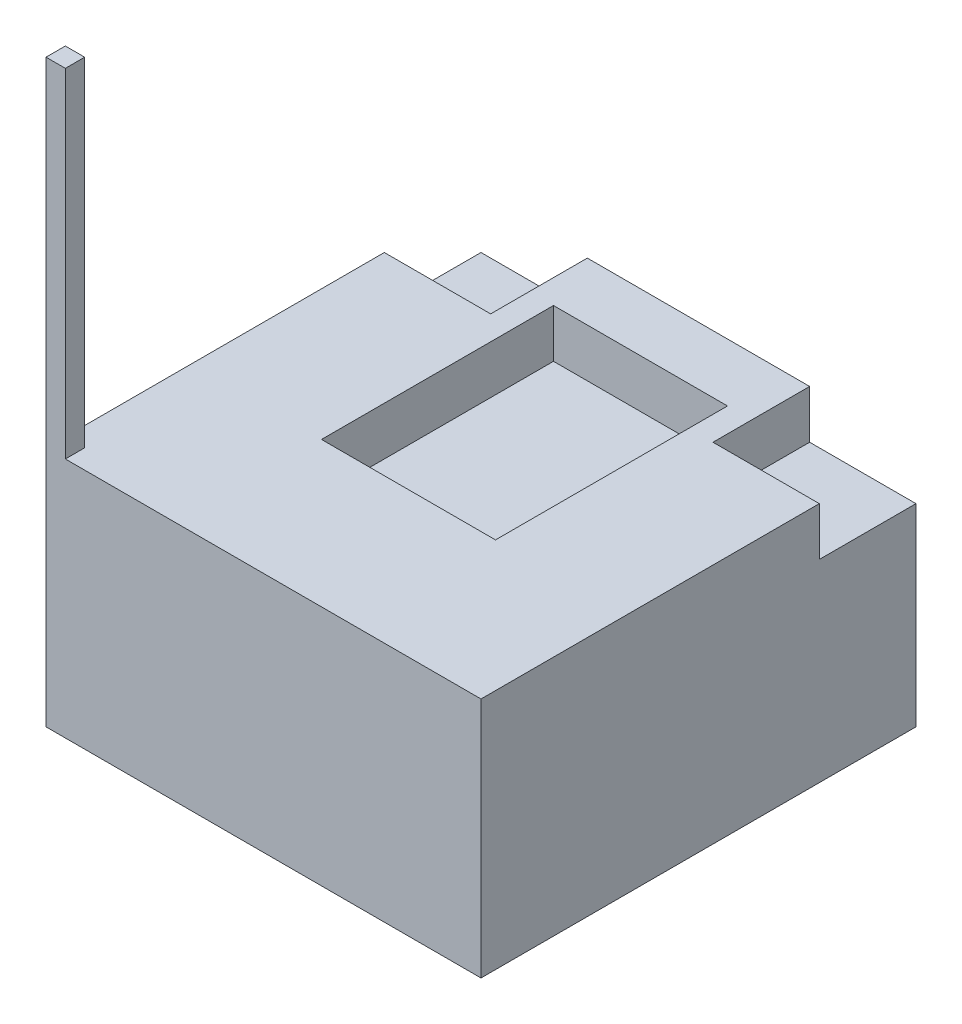
ISO-10303-21;
HEADER;
FILE_DESCRIPTION(('STEP AP214'),'2;1');
FILE_NAME('part.step','',(''),(''),'','','');
FILE_SCHEMA(('AUTOMOTIVE_DESIGN { 1 0 10303 214 1 1 1 1 }'));
ENDSEC;
DATA;
#1=APPLICATION_CONTEXT('core data for automotive mechanical design processes');
#2=APPLICATION_PROTOCOL_DEFINITION('international standard','automotive_design',2000,#1);
#3=PRODUCT_CONTEXT('',#1,'mechanical');
#4=PRODUCT('Part','Part','',(#3));
#5=PRODUCT_RELATED_PRODUCT_CATEGORY('part','',(#4));
#6=PRODUCT_DEFINITION_FORMATION('','',#4);
#7=PRODUCT_DEFINITION_CONTEXT('part definition',#1,'design');
#8=PRODUCT_DEFINITION('design','',#6,#7);
#9=PRODUCT_DEFINITION_SHAPE('','',#8);
#10=(LENGTH_UNIT() NAMED_UNIT(*) SI_UNIT(.MILLI.,.METRE.));
#11=(NAMED_UNIT(*) PLANE_ANGLE_UNIT() SI_UNIT($,.RADIAN.));
#12=(NAMED_UNIT(*) SI_UNIT($,.STERADIAN.) SOLID_ANGLE_UNIT());
#13=UNCERTAINTY_MEASURE_WITH_UNIT(LENGTH_MEASURE(1.E-05),#10,'distance_accuracy_value','');
#14=(GEOMETRIC_REPRESENTATION_CONTEXT(3) GLOBAL_UNCERTAINTY_ASSIGNED_CONTEXT((#13)) GLOBAL_UNIT_ASSIGNED_CONTEXT((#10,
#11,#12)) REPRESENTATION_CONTEXT('',''));
#15=CARTESIAN_POINT('',(0.,0.,0.));
#16=DIRECTION('',(0.,0.,1.));
#17=DIRECTION('',(1.,0.,0.));
#18=AXIS2_PLACEMENT_3D('',#15,#16,#17);
#19=CARTESIAN_POINT('',(225.,250.,-225.));
#20=DIRECTION('',(-1.,0.,0.));
#21=DIRECTION('',(0.,0.,1.));
#22=AXIS2_PLACEMENT_3D('',#19,#20,#21);
#23=PLANE('',#22);
#24=DIRECTION('',(0.,0.,-1.));
#25=VECTOR('',#24,1.);
#26=CARTESIAN_POINT('',(225.,200.,-225.));
#27=LINE('',#26,#25);
#28=CARTESIAN_POINT('',(225.,200.,-125.));
#29=VERTEX_POINT('',#28);
#30=CARTESIAN_POINT('',(225.,200.,-225.));
#31=VERTEX_POINT('',#30);
#32=EDGE_CURVE('E497',#29,#31,#27,.T.);
#33=ORIENTED_EDGE('',*,*,#32,.F.);
#34=DIRECTION('',(0.,1.,0.));
#35=VECTOR('',#34,1.);
#36=CARTESIAN_POINT('',(225.,200.,-125.));
#37=LINE('',#36,#35);
#38=CARTESIAN_POINT('',(225.,250.,-125.));
#39=VERTEX_POINT('',#38);
#40=EDGE_CURVE('E484',#29,#39,#37,.T.);
#41=ORIENTED_EDGE('',*,*,#40,.T.);
#42=DIRECTION('',(0.,0.,-1.));
#43=VECTOR('',#42,1.);
#44=CARTESIAN_POINT('',(225.,250.,-225.));
#45=LINE('',#44,#43);
#46=CARTESIAN_POINT('',(225.,250.,225.));
#47=VERTEX_POINT('',#46);
#48=EDGE_CURVE('E571',#47,#39,#45,.T.);
#49=ORIENTED_EDGE('',*,*,#48,.F.);
#50=DIRECTION('',(0.,-1.,0.));
#51=VECTOR('',#50,1.);
#52=CARTESIAN_POINT('',(225.,250.,225.));
#53=LINE('',#52,#51);
#54=CARTESIAN_POINT('',(225.,0.,225.));
#55=VERTEX_POINT('',#54);
#56=EDGE_CURVE('E585',#47,#55,#53,.T.);
#57=ORIENTED_EDGE('',*,*,#56,.T.);
#58=DIRECTION('',(0.,0.,-1.));
#59=VECTOR('',#58,1.);
#60=CARTESIAN_POINT('',(225.,0.,-225.));
#61=LINE('',#60,#59);
#62=CARTESIAN_POINT('',(225.,0.,-225.));
#63=VERTEX_POINT('',#62);
#64=EDGE_CURVE('E561',#55,#63,#61,.T.);
#65=ORIENTED_EDGE('',*,*,#64,.T.);
#66=DIRECTION('',(0.,-1.,0.));
#67=VECTOR('',#66,1.);
#68=CARTESIAN_POINT('',(225.,250.,-225.));
#69=LINE('',#68,#67);
#70=EDGE_CURVE('E11',#31,#63,#69,.T.);
#71=ORIENTED_EDGE('',*,*,#70,.F.);
#72=EDGE_LOOP('',(#33,#41,#49,#57,#65,#71));
#73=FACE_BOUND('',#72,.T.);
#74=ADVANCED_FACE('F39',(#73),#23,.F.);
#75=CARTESIAN_POINT('',(-225.,250.,-225.));
#76=DIRECTION('',(0.,0.,1.));
#77=DIRECTION('',(1.,0.,0.));
#78=AXIS2_PLACEMENT_3D('',#75,#76,#77);
#79=PLANE('',#78);
#80=DIRECTION('',(-1.,0.,0.));
#81=VECTOR('',#80,1.);
#82=CARTESIAN_POINT('',(105.,230.,-225.));
#83=LINE('',#82,#81);
#84=CARTESIAN_POINT('',(105.,230.,-225.));
#85=VERTEX_POINT('',#84);
#86=CARTESIAN_POINT('',(97.,230.,-225.));
#87=VERTEX_POINT('',#86);
#88=EDGE_CURVE('E396',#85,#87,#83,.T.);
#89=ORIENTED_EDGE('',*,*,#88,.F.);
#90=DIRECTION('',(0.,-1.,0.));
#91=VECTOR('',#90,1.);
#92=CARTESIAN_POINT('',(105.,242.,-225.));
#93=LINE('',#92,#91);
#94=CARTESIAN_POINT('',(105.,242.,-225.));
#95=VERTEX_POINT('',#94);
#96=EDGE_CURVE('E393',#95,#85,#93,.T.);
#97=ORIENTED_EDGE('',*,*,#96,.F.);
#98=DIRECTION('',(1.,0.,0.));
#99=VECTOR('',#98,1.);
#100=CARTESIAN_POINT('',(105.,242.,-225.));
#101=LINE('',#100,#99);
#102=CARTESIAN_POINT('',(97.,242.,-225.));
#103=VERTEX_POINT('',#102);
#104=EDGE_CURVE('E380',#103,#95,#101,.T.);
#105=ORIENTED_EDGE('',*,*,#104,.F.);
#106=DIRECTION('',(0.,1.,0.));
#107=VECTOR('',#106,1.);
#108=CARTESIAN_POINT('',(97.,242.,-225.));
#109=LINE('',#108,#107);
#110=EDGE_CURVE('E401',#87,#103,#109,.T.);
#111=ORIENTED_EDGE('',*,*,#110,.F.);
#112=EDGE_LOOP('',(#89,#97,#105,#111));
#113=FACE_BOUND('',#112,.T.);
#114=DIRECTION('',(0.,-1.,0.));
#115=VECTOR('',#114,1.);
#116=CARTESIAN_POINT('',(-97.,242.,-225.));
#117=LINE('',#116,#115);
#118=CARTESIAN_POINT('',(-97.,242.,-225.));
#119=VERTEX_POINT('',#118);
#120=CARTESIAN_POINT('',(-97.,230.,-225.));
#121=VERTEX_POINT('',#120);
#122=EDGE_CURVE('E441',#119,#121,#117,.T.);
#123=ORIENTED_EDGE('',*,*,#122,.F.);
#124=DIRECTION('',(1.,0.,0.));
#125=VECTOR('',#124,1.);
#126=CARTESIAN_POINT('',(-105.,242.,-225.));
#127=LINE('',#126,#125);
#128=CARTESIAN_POINT('',(-105.,242.,-225.));
#129=VERTEX_POINT('',#128);
#130=EDGE_CURVE('E365',#129,#119,#127,.T.);
#131=ORIENTED_EDGE('',*,*,#130,.F.);
#132=DIRECTION('',(0.,1.,0.));
#133=VECTOR('',#132,1.);
#134=CARTESIAN_POINT('',(-105.,242.,-225.));
#135=LINE('',#134,#133);
#136=CARTESIAN_POINT('',(-105.,230.,-225.));
#137=VERTEX_POINT('',#136);
#138=EDGE_CURVE('E426',#137,#129,#135,.T.);
#139=ORIENTED_EDGE('',*,*,#138,.F.);
#140=DIRECTION('',(-1.,0.,0.));
#141=VECTOR('',#140,1.);
#142=CARTESIAN_POINT('',(-105.,230.,-225.));
#143=LINE('',#142,#141);
#144=EDGE_CURVE('E445',#121,#137,#143,.T.);
#145=ORIENTED_EDGE('',*,*,#144,.F.);
#146=EDGE_LOOP('',(#123,#131,#139,#145));
#147=FACE_BOUND('',#146,.T.);
#148=DIRECTION('',(0.,1.,0.));
#149=VECTOR('',#148,1.);
#150=CARTESIAN_POINT('',(-205.,250.,-225.));
#151=LINE('',#150,#149);
#152=CARTESIAN_POINT('',(-205.,0.,-225.));
#153=VERTEX_POINT('',#152);
#154=CARTESIAN_POINT('',(-205.,20.,-225.));
#155=VERTEX_POINT('',#154);
#156=EDGE_CURVE('E54',#153,#155,#151,.T.);
#157=ORIENTED_EDGE('',*,*,#156,.T.);
#158=DIRECTION('',(-1.,0.,0.));
#159=VECTOR('',#158,1.);
#160=CARTESIAN_POINT('',(-225.,20.,-225.));
#161=LINE('',#160,#159);
#162=CARTESIAN_POINT('',(-225.,20.,-225.));
#163=VERTEX_POINT('',#162);
#164=EDGE_CURVE('E58',#155,#163,#161,.T.);
#165=ORIENTED_EDGE('',*,*,#164,.T.);
#166=DIRECTION('',(0.,-1.,0.));
#167=VECTOR('',#166,1.);
#168=CARTESIAN_POINT('',(-225.,250.,-225.));
#169=LINE('',#168,#167);
#170=CARTESIAN_POINT('',(-225.,200.,-225.));
#171=VERTEX_POINT('',#170);
#172=EDGE_CURVE('E47',#171,#163,#169,.T.);
#173=ORIENTED_EDGE('',*,*,#172,.F.);
#174=DIRECTION('',(-1.,0.,0.));
#175=VECTOR('',#174,1.);
#176=CARTESIAN_POINT('',(-225.,200.,-225.));
#177=LINE('',#176,#175);
#178=CARTESIAN_POINT('',(-115.,200.,-225.));
#179=VERTEX_POINT('',#178);
#180=EDGE_CURVE('E476',#179,#171,#177,.T.);
#181=ORIENTED_EDGE('',*,*,#180,.F.);
#182=DIRECTION('',(0.,1.,0.));
#183=VECTOR('',#182,1.);
#184=CARTESIAN_POINT('',(-115.,200.,-225.));
#185=LINE('',#184,#183);
#186=CARTESIAN_POINT('',(-115.,250.,-225.));
#187=VERTEX_POINT('',#186);
#188=EDGE_CURVE('E487',#179,#187,#185,.T.);
#189=ORIENTED_EDGE('',*,*,#188,.T.);
#190=DIRECTION('',(-1.,0.,0.));
#191=VECTOR('',#190,1.);
#192=CARTESIAN_POINT('',(-225.,250.,-225.));
#193=LINE('',#192,#191);
#194=CARTESIAN_POINT('',(115.,250.,-225.));
#195=VERTEX_POINT('',#194);
#196=EDGE_CURVE('E575',#195,#187,#193,.T.);
#197=ORIENTED_EDGE('',*,*,#196,.F.);
#198=DIRECTION('',(0.,1.,0.));
#199=VECTOR('',#198,1.);
#200=CARTESIAN_POINT('',(115.,200.,-225.));
#201=LINE('',#200,#199);
#202=CARTESIAN_POINT('',(115.,200.,-225.));
#203=VERTEX_POINT('',#202);
#204=EDGE_CURVE('E513',#203,#195,#201,.T.);
#205=ORIENTED_EDGE('',*,*,#204,.F.);
#206=DIRECTION('',(-1.,0.,0.));
#207=VECTOR('',#206,1.);
#208=CARTESIAN_POINT('',(225.,200.,-225.));
#209=LINE('',#208,#207);
#210=EDGE_CURVE('E500',#31,#203,#209,.T.);
#211=ORIENTED_EDGE('',*,*,#210,.F.);
#212=ORIENTED_EDGE('',*,*,#70,.T.);
#213=DIRECTION('',(-1.,0.,0.));
#214=VECTOR('',#213,1.);
#215=CARTESIAN_POINT('',(-225.,0.,-225.));
#216=LINE('',#215,#214);
#217=EDGE_CURVE('E257',#63,#153,#216,.T.);
#218=ORIENTED_EDGE('',*,*,#217,.T.);
#219=EDGE_LOOP('',(#157,#165,#173,#181,#189,#197,#205,#211,#212,#218));
#220=FACE_BOUND('',#219,.T.);
#221=ADVANCED_FACE('F634',(#113,#147,#220),#79,.F.);
#222=CARTESIAN_POINT('',(-225.,250.,-225.));
#223=DIRECTION('',(1.,0.,0.));
#224=DIRECTION('',(0.,0.,-1.));
#225=AXIS2_PLACEMENT_3D('',#222,#223,#224);
#226=PLANE('',#225);
#227=ORIENTED_EDGE('',*,*,#172,.T.);
#228=DIRECTION('',(0.,0.,1.));
#229=VECTOR('',#228,1.);
#230=CARTESIAN_POINT('',(-225.,20.,-375.));
#231=LINE('',#230,#229);
#232=CARTESIAN_POINT('',(-225.,20.,-375.));
#233=VERTEX_POINT('',#232);
#234=EDGE_CURVE('E272',#233,#163,#231,.T.);
#235=ORIENTED_EDGE('',*,*,#234,.F.);
#236=DIRECTION('',(0.,-1.,0.));
#237=VECTOR('',#236,1.);
#238=CARTESIAN_POINT('',(-225.,0.,-375.));
#239=LINE('',#238,#237);
#240=CARTESIAN_POINT('',(-225.,0.,-375.));
#241=VERTEX_POINT('',#240);
#242=EDGE_CURVE('E264',#233,#241,#239,.T.);
#243=ORIENTED_EDGE('',*,*,#242,.T.);
#244=DIRECTION('',(0.,0.,1.));
#245=VECTOR('',#244,1.);
#246=CARTESIAN_POINT('',(-225.,0.,-225.));
#247=LINE('',#246,#245);
#248=CARTESIAN_POINT('',(-225.,0.,225.));
#249=VERTEX_POINT('',#248);
#250=EDGE_CURVE('E247',#241,#249,#247,.T.);
#251=ORIENTED_EDGE('',*,*,#250,.T.);
#252=DIRECTION('',(0.,-1.,0.));
#253=VECTOR('',#252,1.);
#254=CARTESIAN_POINT('',(-225.,250.,225.));
#255=LINE('',#254,#253);
#256=CARTESIAN_POINT('',(-225.,600.,225.));
#257=VERTEX_POINT('',#256);
#258=EDGE_CURVE('E596',#257,#249,#255,.T.);
#259=ORIENTED_EDGE('',*,*,#258,.F.);
#260=DIRECTION('',(0.,0.,-1.));
#261=VECTOR('',#260,1.);
#262=CARTESIAN_POINT('',(-225.,600.,225.));
#263=LINE('',#262,#261);
#264=CARTESIAN_POINT('',(-225.,600.,205.));
#265=VERTEX_POINT('',#264);
#266=EDGE_CURVE('E294',#257,#265,#263,.T.);
#267=ORIENTED_EDGE('',*,*,#266,.T.);
#268=DIRECTION('',(0.,-1.,0.));
#269=VECTOR('',#268,1.);
#270=CARTESIAN_POINT('',(-225.,600.,205.));
#271=LINE('',#270,#269);
#272=CARTESIAN_POINT('',(-225.,250.,205.));
#273=VERTEX_POINT('',#272);
#274=EDGE_CURVE('E310',#265,#273,#271,.T.);
#275=ORIENTED_EDGE('',*,*,#274,.T.);
#276=DIRECTION('',(0.,0.,1.));
#277=VECTOR('',#276,1.);
#278=CARTESIAN_POINT('',(-225.,250.,-225.));
#279=LINE('',#278,#277);
#280=CARTESIAN_POINT('',(-225.,250.,-125.));
#281=VERTEX_POINT('',#280);
#282=EDGE_CURVE('E579',#281,#273,#279,.T.);
#283=ORIENTED_EDGE('',*,*,#282,.F.);
#284=DIRECTION('',(0.,1.,0.));
#285=VECTOR('',#284,1.);
#286=CARTESIAN_POINT('',(-225.,200.,-125.));
#287=LINE('',#286,#285);
#288=CARTESIAN_POINT('',(-225.,200.,-125.));
#289=VERTEX_POINT('',#288);
#290=EDGE_CURVE('E479',#289,#281,#287,.T.);
#291=ORIENTED_EDGE('',*,*,#290,.F.);
#292=DIRECTION('',(0.,0.,1.));
#293=VECTOR('',#292,1.);
#294=CARTESIAN_POINT('',(-225.,200.,-225.));
#295=LINE('',#294,#293);
#296=EDGE_CURVE('E463',#171,#289,#295,.T.);
#297=ORIENTED_EDGE('',*,*,#296,.F.);
#298=EDGE_LOOP('',(#227,#235,#243,#251,#259,#267,#275,#283,#291,#297));
#299=FACE_BOUND('',#298,.T.);
#300=ADVANCED_FACE('F270',(#299),#226,.F.);
#301=CARTESIAN_POINT('',(-225.,250.,225.));
#302=DIRECTION('',(0.,0.,-1.));
#303=DIRECTION('',(-1.,0.,0.));
#304=AXIS2_PLACEMENT_3D('',#301,#302,#303);
#305=PLANE('',#304);
#306=ORIENTED_EDGE('',*,*,#258,.T.);
#307=DIRECTION('',(1.,0.,0.));
#308=VECTOR('',#307,1.);
#309=CARTESIAN_POINT('',(-225.,0.,225.));
#310=LINE('',#309,#308);
#311=EDGE_CURVE('E253',#249,#55,#310,.T.);
#312=ORIENTED_EDGE('',*,*,#311,.T.);
#313=ORIENTED_EDGE('',*,*,#56,.F.);
#314=DIRECTION('',(1.,0.,0.));
#315=VECTOR('',#314,1.);
#316=CARTESIAN_POINT('',(-225.,250.,225.));
#317=LINE('',#316,#315);
#318=CARTESIAN_POINT('',(-205.,250.,225.));
#319=VERTEX_POINT('',#318);
#320=EDGE_CURVE('E582',#319,#47,#317,.T.);
#321=ORIENTED_EDGE('',*,*,#320,.F.);
#322=DIRECTION('',(0.,-1.,0.));
#323=VECTOR('',#322,1.);
#324=CARTESIAN_POINT('',(-205.,600.,225.));
#325=LINE('',#324,#323);
#326=CARTESIAN_POINT('',(-205.,600.,225.));
#327=VERTEX_POINT('',#326);
#328=EDGE_CURVE('E311',#327,#319,#325,.T.);
#329=ORIENTED_EDGE('',*,*,#328,.F.);
#330=DIRECTION('',(-1.,0.,0.));
#331=VECTOR('',#330,1.);
#332=CARTESIAN_POINT('',(-225.,600.,225.));
#333=LINE('',#332,#331);
#334=EDGE_CURVE('E306',#327,#257,#333,.T.);
#335=ORIENTED_EDGE('',*,*,#334,.T.);
#336=EDGE_LOOP('',(#306,#312,#313,#321,#329,#335));
#337=FACE_BOUND('',#336,.T.);
#338=ADVANCED_FACE('F614',(#337),#305,.F.);
#339=CARTESIAN_POINT('',(0.,250.,0.));
#340=DIRECTION('',(0.,1.,0.));
#341=DIRECTION('',(0.,0.,1.));
#342=AXIS2_PLACEMENT_3D('',#339,#340,#341);
#343=PLANE('',#342);
#344=DIRECTION('',(0.,0.,-1.));
#345=VECTOR('',#344,1.);
#346=CARTESIAN_POINT('',(-205.,250.,0.));
#347=LINE('',#346,#345);
#348=CARTESIAN_POINT('',(-205.,250.,205.));
#349=VERTEX_POINT('',#348);
#350=EDGE_CURVE('E326',#319,#349,#347,.T.);
#351=ORIENTED_EDGE('',*,*,#350,.F.);
#352=ORIENTED_EDGE('',*,*,#320,.T.);
#353=ORIENTED_EDGE('',*,*,#48,.T.);
#354=DIRECTION('',(1.,0.,0.));
#355=VECTOR('',#354,1.);
#356=CARTESIAN_POINT('',(225.,250.,-125.));
#357=LINE('',#356,#355);
#358=CARTESIAN_POINT('',(115.,250.,-125.));
#359=VERTEX_POINT('',#358);
#360=EDGE_CURVE('E501',#359,#39,#357,.T.);
#361=ORIENTED_EDGE('',*,*,#360,.F.);
#362=DIRECTION('',(0.,0.,1.));
#363=VECTOR('',#362,1.);
#364=CARTESIAN_POINT('',(115.,250.,-225.));
#365=LINE('',#364,#363);
#366=EDGE_CURVE('E411',#195,#359,#365,.T.);
#367=ORIENTED_EDGE('',*,*,#366,.F.);
#368=ORIENTED_EDGE('',*,*,#196,.T.);
#369=DIRECTION('',(0.,0.,-1.));
#370=VECTOR('',#369,1.);
#371=CARTESIAN_POINT('',(-115.,250.,-225.));
#372=LINE('',#371,#370);
#373=CARTESIAN_POINT('',(-115.,250.,-125.));
#374=VERTEX_POINT('',#373);
#375=EDGE_CURVE('E468',#374,#187,#372,.T.);
#376=ORIENTED_EDGE('',*,*,#375,.F.);
#377=DIRECTION('',(1.,0.,0.));
#378=VECTOR('',#377,1.);
#379=CARTESIAN_POINT('',(-225.,250.,-125.));
#380=LINE('',#379,#378);
#381=EDGE_CURVE('E480',#281,#374,#380,.T.);
#382=ORIENTED_EDGE('',*,*,#381,.F.);
#383=ORIENTED_EDGE('',*,*,#282,.T.);
#384=DIRECTION('',(-1.,0.,0.));
#385=VECTOR('',#384,1.);
#386=CARTESIAN_POINT('',(0.,250.,205.));
#387=LINE('',#386,#385);
#388=EDGE_CURVE('E315',#349,#273,#387,.T.);
#389=ORIENTED_EDGE('',*,*,#388,.F.);
#390=EDGE_LOOP('',(#351,#352,#353,#361,#367,#368,#376,#382,#383,#389));
#391=FACE_BOUND('',#390,.T.);
#392=DIRECTION('',(0.,0.,-1.));
#393=VECTOR('',#392,1.);
#394=CARTESIAN_POINT('',(90.,250.,-165.));
#395=LINE('',#394,#393);
#396=CARTESIAN_POINT('',(90.0000000000001,250.,74.9999999999999));
#397=VERTEX_POINT('',#396);
#398=CARTESIAN_POINT('',(90.,250.,-165.));
#399=VERTEX_POINT('',#398);
#400=EDGE_CURVE('E491',#397,#399,#395,.T.);
#401=ORIENTED_EDGE('',*,*,#400,.F.);
#402=DIRECTION('',(1.,0.,0.));
#403=VECTOR('',#402,1.);
#404=CARTESIAN_POINT('',(-89.9999999999999,250.,74.9999999999999));
#405=LINE('',#404,#403);
#406=CARTESIAN_POINT('',(-89.9999999999999,250.,74.9999999999999));
#407=VERTEX_POINT('',#406);
#408=EDGE_CURVE('E532',#407,#397,#405,.T.);
#409=ORIENTED_EDGE('',*,*,#408,.F.);
#410=DIRECTION('',(0.,0.,1.));
#411=VECTOR('',#410,1.);
#412=CARTESIAN_POINT('',(-90.,250.,-165.));
#413=LINE('',#412,#411);
#414=CARTESIAN_POINT('',(-90.,250.,-165.));
#415=VERTEX_POINT('',#414);
#416=EDGE_CURVE('E551',#415,#407,#413,.T.);
#417=ORIENTED_EDGE('',*,*,#416,.F.);
#418=DIRECTION('',(-1.,0.,0.));
#419=VECTOR('',#418,1.);
#420=CARTESIAN_POINT('',(-90.,250.,-165.));
#421=LINE('',#420,#419);
#422=EDGE_CURVE('E547',#399,#415,#421,.T.);
#423=ORIENTED_EDGE('',*,*,#422,.F.);
#424=EDGE_LOOP('',(#401,#409,#417,#423));
#425=FACE_BOUND('',#424,.T.);
#426=ADVANCED_FACE('F626',(#391,#425),#343,.T.);
#427=CARTESIAN_POINT('',(0.,0.,0.));
#428=DIRECTION('',(0.,1.,0.));
#429=DIRECTION('',(0.,0.,1.));
#430=AXIS2_PLACEMENT_3D('',#427,#428,#429);
#431=PLANE('',#430);
#432=ORIENTED_EDGE('',*,*,#64,.F.);
#433=ORIENTED_EDGE('',*,*,#311,.F.);
#434=ORIENTED_EDGE('',*,*,#250,.F.);
#435=DIRECTION('',(1.,0.,0.));
#436=VECTOR('',#435,1.);
#437=CARTESIAN_POINT('',(-225.,0.,-375.));
#438=LINE('',#437,#436);
#439=CARTESIAN_POINT('',(-205.,0.,-375.));
#440=VERTEX_POINT('',#439);
#441=EDGE_CURVE('E252',#241,#440,#438,.T.);
#442=ORIENTED_EDGE('',*,*,#441,.T.);
#443=DIRECTION('',(0.,0.,1.));
#444=VECTOR('',#443,1.);
#445=CARTESIAN_POINT('',(-205.,0.,-375.));
#446=LINE('',#445,#444);
#447=EDGE_CURVE('E281',#440,#153,#446,.T.);
#448=ORIENTED_EDGE('',*,*,#447,.T.);
#449=ORIENTED_EDGE('',*,*,#217,.F.);
#450=EDGE_LOOP('',(#432,#433,#434,#442,#448,#449));
#451=FACE_BOUND('',#450,.T.);
#452=ADVANCED_FACE('F250',(#451),#431,.F.);
#453=CARTESIAN_POINT('',(90.,200.,-165.));
#454=DIRECTION('',(1.,0.,0.));
#455=DIRECTION('',(0.,0.,-1.));
#456=AXIS2_PLACEMENT_3D('',#453,#454,#455);
#457=PLANE('',#456);
#458=ORIENTED_EDGE('',*,*,#400,.T.);
#459=DIRECTION('',(0.,1.,0.));
#460=VECTOR('',#459,1.);
#461=CARTESIAN_POINT('',(90.,200.,-165.));
#462=LINE('',#461,#460);
#463=CARTESIAN_POINT('',(90.,200.,-165.));
#464=VERTEX_POINT('',#463);
#465=EDGE_CURVE('E544',#464,#399,#462,.T.);
#466=ORIENTED_EDGE('',*,*,#465,.F.);
#467=DIRECTION('',(0.,0.,-1.));
#468=VECTOR('',#467,1.);
#469=CARTESIAN_POINT('',(90.,200.,-165.));
#470=LINE('',#469,#468);
#471=CARTESIAN_POINT('',(90.0000000000001,200.,74.9999999999999));
#472=VERTEX_POINT('',#471);
#473=EDGE_CURVE('E527',#472,#464,#470,.T.);
#474=ORIENTED_EDGE('',*,*,#473,.F.);
#475=DIRECTION('',(0.,1.,0.));
#476=VECTOR('',#475,1.);
#477=CARTESIAN_POINT('',(90.0000000000001,200.,74.9999999999999));
#478=LINE('',#477,#476);
#479=EDGE_CURVE('E558',#472,#397,#478,.T.);
#480=ORIENTED_EDGE('',*,*,#479,.T.);
#481=EDGE_LOOP('',(#458,#466,#474,#480));
#482=FACE_BOUND('',#481,.T.);
#483=ADVANCED_FACE('F681',(#482),#457,.F.);
#484=CARTESIAN_POINT('',(-89.9999999999999,200.,74.9999999999999));
#485=DIRECTION('',(0.,0.,1.));
#486=DIRECTION('',(1.,0.,0.));
#487=AXIS2_PLACEMENT_3D('',#484,#485,#486);
#488=PLANE('',#487);
#489=ORIENTED_EDGE('',*,*,#408,.T.);
#490=ORIENTED_EDGE('',*,*,#479,.F.);
#491=DIRECTION('',(1.,0.,0.));
#492=VECTOR('',#491,1.);
#493=CARTESIAN_POINT('',(-89.9999999999999,200.,74.9999999999999));
#494=LINE('',#493,#492);
#495=CARTESIAN_POINT('',(-89.9999999999999,200.,74.9999999999999));
#496=VERTEX_POINT('',#495);
#497=EDGE_CURVE('E540',#496,#472,#494,.T.);
#498=ORIENTED_EDGE('',*,*,#497,.F.);
#499=DIRECTION('',(0.,1.,0.));
#500=VECTOR('',#499,1.);
#501=CARTESIAN_POINT('',(-89.9999999999999,200.,74.9999999999999));
#502=LINE('',#501,#500);
#503=EDGE_CURVE('E562',#496,#407,#502,.T.);
#504=ORIENTED_EDGE('',*,*,#503,.T.);
#505=EDGE_LOOP('',(#489,#490,#498,#504));
#506=FACE_BOUND('',#505,.T.);
#507=ADVANCED_FACE('F686',(#506),#488,.F.);
#508=CARTESIAN_POINT('',(-90.,200.,-165.));
#509=DIRECTION('',(-1.,0.,0.));
#510=DIRECTION('',(0.,0.,1.));
#511=AXIS2_PLACEMENT_3D('',#508,#509,#510);
#512=PLANE('',#511);
#513=ORIENTED_EDGE('',*,*,#416,.T.);
#514=ORIENTED_EDGE('',*,*,#503,.F.);
#515=DIRECTION('',(0.,0.,1.));
#516=VECTOR('',#515,1.);
#517=CARTESIAN_POINT('',(-90.,200.,-165.));
#518=LINE('',#517,#516);
#519=CARTESIAN_POINT('',(-90.,200.,-165.));
#520=VERTEX_POINT('',#519);
#521=EDGE_CURVE('E536',#520,#496,#518,.T.);
#522=ORIENTED_EDGE('',*,*,#521,.F.);
#523=DIRECTION('',(0.,1.,0.));
#524=VECTOR('',#523,1.);
#525=CARTESIAN_POINT('',(-90.,200.,-165.));
#526=LINE('',#525,#524);
#527=EDGE_CURVE('E565',#520,#415,#526,.T.);
#528=ORIENTED_EDGE('',*,*,#527,.T.);
#529=EDGE_LOOP('',(#513,#514,#522,#528));
#530=FACE_BOUND('',#529,.T.);
#531=ADVANCED_FACE('F692',(#530),#512,.F.);
#532=CARTESIAN_POINT('',(-90.,200.,-165.));
#533=DIRECTION('',(0.,0.,-1.));
#534=DIRECTION('',(-1.,0.,0.));
#535=AXIS2_PLACEMENT_3D('',#532,#533,#534);
#536=PLANE('',#535);
#537=ORIENTED_EDGE('',*,*,#422,.T.);
#538=ORIENTED_EDGE('',*,*,#527,.F.);
#539=DIRECTION('',(-1.,0.,0.));
#540=VECTOR('',#539,1.);
#541=CARTESIAN_POINT('',(-90.,200.,-165.));
#542=LINE('',#541,#540);
#543=EDGE_CURVE('E531',#464,#520,#542,.T.);
#544=ORIENTED_EDGE('',*,*,#543,.F.);
#545=ORIENTED_EDGE('',*,*,#465,.T.);
#546=EDGE_LOOP('',(#537,#538,#544,#545));
#547=FACE_BOUND('',#546,.T.);
#548=ADVANCED_FACE('F688',(#547),#536,.F.);
#549=CARTESIAN_POINT('',(0.,200.,0.));
#550=DIRECTION('',(0.,1.,0.));
#551=DIRECTION('',(0.,0.,1.));
#552=AXIS2_PLACEMENT_3D('',#549,#550,#551);
#553=PLANE('',#552);
#554=ORIENTED_EDGE('',*,*,#473,.T.);
#555=ORIENTED_EDGE('',*,*,#543,.T.);
#556=ORIENTED_EDGE('',*,*,#521,.T.);
#557=ORIENTED_EDGE('',*,*,#497,.T.);
#558=EDGE_LOOP('',(#554,#555,#556,#557));
#559=FACE_BOUND('',#558,.T.);
#560=ADVANCED_FACE('F691',(#559),#553,.T.);
#561=CARTESIAN_POINT('',(225.,200.,-125.));
#562=DIRECTION('',(0.,0.,1.));
#563=DIRECTION('',(1.,0.,0.));
#564=AXIS2_PLACEMENT_3D('',#561,#562,#563);
#565=PLANE('',#564);
#566=ORIENTED_EDGE('',*,*,#360,.T.);
#567=ORIENTED_EDGE('',*,*,#40,.F.);
#568=DIRECTION('',(1.,0.,0.));
#569=VECTOR('',#568,1.);
#570=CARTESIAN_POINT('',(225.,200.,-125.));
#571=LINE('',#570,#569);
#572=CARTESIAN_POINT('',(115.,200.,-125.));
#573=VERTEX_POINT('',#572);
#574=EDGE_CURVE('E509',#573,#29,#571,.T.);
#575=ORIENTED_EDGE('',*,*,#574,.F.);
#576=DIRECTION('',(0.,1.,0.));
#577=VECTOR('',#576,1.);
#578=CARTESIAN_POINT('',(115.,200.,-125.));
#579=LINE('',#578,#577);
#580=EDGE_CURVE('E522',#573,#359,#579,.T.);
#581=ORIENTED_EDGE('',*,*,#580,.T.);
#582=EDGE_LOOP('',(#566,#567,#575,#581));
#583=FACE_BOUND('',#582,.T.);
#584=ADVANCED_FACE('F702',(#583),#565,.F.);
#585=CARTESIAN_POINT('',(115.,200.,-225.));
#586=DIRECTION('',(-1.,0.,0.));
#587=DIRECTION('',(0.,0.,1.));
#588=AXIS2_PLACEMENT_3D('',#585,#586,#587);
#589=PLANE('',#588);
#590=ORIENTED_EDGE('',*,*,#366,.T.);
#591=ORIENTED_EDGE('',*,*,#580,.F.);
#592=DIRECTION('',(0.,0.,1.));
#593=VECTOR('',#592,1.);
#594=CARTESIAN_POINT('',(115.,200.,-225.));
#595=LINE('',#594,#593);
#596=EDGE_CURVE('E505',#203,#573,#595,.T.);
#597=ORIENTED_EDGE('',*,*,#596,.F.);
#598=ORIENTED_EDGE('',*,*,#204,.T.);
#599=EDGE_LOOP('',(#590,#591,#597,#598));
#600=FACE_BOUND('',#599,.T.);
#601=ADVANCED_FACE('F641',(#600),#589,.F.);
#602=CARTESIAN_POINT('',(0.,200.,0.));
#603=DIRECTION('',(0.,-1.,0.));
#604=DIRECTION('',(0.,0.,-1.));
#605=AXIS2_PLACEMENT_3D('',#602,#603,#604);
#606=PLANE('',#605);
#607=ORIENTED_EDGE('',*,*,#32,.T.);
#608=ORIENTED_EDGE('',*,*,#210,.T.);
#609=ORIENTED_EDGE('',*,*,#596,.T.);
#610=ORIENTED_EDGE('',*,*,#574,.T.);
#611=EDGE_LOOP('',(#607,#608,#609,#610));
#612=FACE_BOUND('',#611,.T.);
#613=ADVANCED_FACE('F644',(#612),#606,.F.);
#614=CARTESIAN_POINT('',(-115.,200.,-225.));
#615=DIRECTION('',(1.,0.,0.));
#616=DIRECTION('',(0.,0.,-1.));
#617=AXIS2_PLACEMENT_3D('',#614,#615,#616);
#618=PLANE('',#617);
#619=ORIENTED_EDGE('',*,*,#375,.T.);
#620=ORIENTED_EDGE('',*,*,#188,.F.);
#621=DIRECTION('',(0.,0.,-1.));
#622=VECTOR('',#621,1.);
#623=CARTESIAN_POINT('',(-115.,200.,-225.));
#624=LINE('',#623,#622);
#625=CARTESIAN_POINT('',(-115.,200.,-125.));
#626=VERTEX_POINT('',#625);
#627=EDGE_CURVE('E472',#626,#179,#624,.T.);
#628=ORIENTED_EDGE('',*,*,#627,.F.);
#629=DIRECTION('',(0.,1.,0.));
#630=VECTOR('',#629,1.);
#631=CARTESIAN_POINT('',(-115.,200.,-125.));
#632=LINE('',#631,#630);
#633=EDGE_CURVE('E492',#626,#374,#632,.T.);
#634=ORIENTED_EDGE('',*,*,#633,.T.);
#635=EDGE_LOOP('',(#619,#620,#628,#634));
#636=FACE_BOUND('',#635,.T.);
#637=ADVANCED_FACE('F710',(#636),#618,.F.);
#638=CARTESIAN_POINT('',(-225.,200.,-125.));
#639=DIRECTION('',(0.,0.,1.));
#640=DIRECTION('',(1.,0.,0.));
#641=AXIS2_PLACEMENT_3D('',#638,#639,#640);
#642=PLANE('',#641);
#643=DIRECTION('',(-1.,0.,0.));
#644=VECTOR('',#643,1.);
#645=CARTESIAN_POINT('',(-212.,230.,-125.));
#646=LINE('',#645,#644);
#647=CARTESIAN_POINT('',(-212.,230.,-125.));
#648=VERTEX_POINT('',#647);
#649=CARTESIAN_POINT('',(-220.,230.,-125.));
#650=VERTEX_POINT('',#649);
#651=EDGE_CURVE('E351',#648,#650,#646,.T.);
#652=ORIENTED_EDGE('',*,*,#651,.F.);
#653=DIRECTION('',(0.,-1.,0.));
#654=VECTOR('',#653,1.);
#655=CARTESIAN_POINT('',(-212.,242.,-125.));
#656=LINE('',#655,#654);
#657=CARTESIAN_POINT('',(-212.,242.,-125.));
#658=VERTEX_POINT('',#657);
#659=EDGE_CURVE('E330',#658,#648,#656,.T.);
#660=ORIENTED_EDGE('',*,*,#659,.F.);
#661=DIRECTION('',(1.,0.,0.));
#662=VECTOR('',#661,1.);
#663=CARTESIAN_POINT('',(-212.,242.,-125.));
#664=LINE('',#663,#662);
#665=CARTESIAN_POINT('',(-220.,242.,-125.));
#666=VERTEX_POINT('',#665);
#667=EDGE_CURVE('E336',#666,#658,#664,.T.);
#668=ORIENTED_EDGE('',*,*,#667,.F.);
#669=DIRECTION('',(0.,1.,0.));
#670=VECTOR('',#669,1.);
#671=CARTESIAN_POINT('',(-220.,242.,-125.));
#672=LINE('',#671,#670);
#673=EDGE_CURVE('E355',#650,#666,#672,.T.);
#674=ORIENTED_EDGE('',*,*,#673,.F.);
#675=EDGE_LOOP('',(#652,#660,#668,#674));
#676=FACE_BOUND('',#675,.T.);
#677=ORIENTED_EDGE('',*,*,#381,.T.);
#678=ORIENTED_EDGE('',*,*,#633,.F.);
#679=DIRECTION('',(1.,0.,0.));
#680=VECTOR('',#679,1.);
#681=CARTESIAN_POINT('',(-225.,200.,-125.));
#682=LINE('',#681,#680);
#683=EDGE_CURVE('E467',#289,#626,#682,.T.);
#684=ORIENTED_EDGE('',*,*,#683,.F.);
#685=ORIENTED_EDGE('',*,*,#290,.T.);
#686=EDGE_LOOP('',(#677,#678,#684,#685));
#687=FACE_BOUND('',#686,.T.);
#688=ADVANCED_FACE('F630',(#676,#687),#642,.F.);
#689=CARTESIAN_POINT('',(0.,200.,0.));
#690=DIRECTION('',(0.,1.,0.));
#691=DIRECTION('',(0.,0.,1.));
#692=AXIS2_PLACEMENT_3D('',#689,#690,#691);
#693=PLANE('',#692);
#694=ORIENTED_EDGE('',*,*,#296,.T.);
#695=ORIENTED_EDGE('',*,*,#683,.T.);
#696=ORIENTED_EDGE('',*,*,#627,.T.);
#697=ORIENTED_EDGE('',*,*,#180,.T.);
#698=EDGE_LOOP('',(#694,#695,#696,#697));
#699=FACE_BOUND('',#698,.T.);
#700=ADVANCED_FACE('F633',(#699),#693,.T.);
#701=CARTESIAN_POINT('',(-105.,242.,-205.));
#702=DIRECTION('',(0.,1.,0.));
#703=DIRECTION('',(0.,0.,1.));
#704=AXIS2_PLACEMENT_3D('',#701,#702,#703);
#705=PLANE('',#704);
#706=ORIENTED_EDGE('',*,*,#130,.T.);
#707=DIRECTION('',(0.,0.,-1.));
#708=VECTOR('',#707,1.);
#709=CARTESIAN_POINT('',(-97.,242.,-205.));
#710=LINE('',#709,#708);
#711=CARTESIAN_POINT('',(-97.,242.,-205.));
#712=VERTEX_POINT('',#711);
#713=EDGE_CURVE('E438',#712,#119,#710,.T.);
#714=ORIENTED_EDGE('',*,*,#713,.F.);
#715=DIRECTION('',(1.,0.,0.));
#716=VECTOR('',#715,1.);
#717=CARTESIAN_POINT('',(-105.,242.,-205.));
#718=LINE('',#717,#716);
#719=CARTESIAN_POINT('',(-105.,242.,-205.));
#720=VERTEX_POINT('',#719);
#721=EDGE_CURVE('E421',#720,#712,#718,.T.);
#722=ORIENTED_EDGE('',*,*,#721,.F.);
#723=DIRECTION('',(0.,0.,-1.));
#724=VECTOR('',#723,1.);
#725=CARTESIAN_POINT('',(-105.,242.,-205.));
#726=LINE('',#725,#724);
#727=EDGE_CURVE('E397',#720,#129,#726,.T.);
#728=ORIENTED_EDGE('',*,*,#727,.T.);
#729=EDGE_LOOP('',(#706,#714,#722,#728));
#730=FACE_BOUND('',#729,.T.);
#731=ADVANCED_FACE('F718',(#730),#705,.F.);
#732=CARTESIAN_POINT('',(-105.,242.,-205.));
#733=DIRECTION('',(-1.,0.,0.));
#734=DIRECTION('',(0.,0.,1.));
#735=AXIS2_PLACEMENT_3D('',#732,#733,#734);
#736=PLANE('',#735);
#737=ORIENTED_EDGE('',*,*,#138,.T.);
#738=ORIENTED_EDGE('',*,*,#727,.F.);
#739=DIRECTION('',(0.,1.,0.));
#740=VECTOR('',#739,1.);
#741=CARTESIAN_POINT('',(-105.,242.,-205.));
#742=LINE('',#741,#740);
#743=CARTESIAN_POINT('',(-105.,230.,-205.));
#744=VERTEX_POINT('',#743);
#745=EDGE_CURVE('E434',#744,#720,#742,.T.);
#746=ORIENTED_EDGE('',*,*,#745,.F.);
#747=DIRECTION('',(0.,0.,-1.));
#748=VECTOR('',#747,1.);
#749=CARTESIAN_POINT('',(-105.,230.,-205.));
#750=LINE('',#749,#748);
#751=EDGE_CURVE('E454',#744,#137,#750,.T.);
#752=ORIENTED_EDGE('',*,*,#751,.T.);
#753=EDGE_LOOP('',(#737,#738,#746,#752));
#754=FACE_BOUND('',#753,.T.);
#755=ADVANCED_FACE('F721',(#754),#736,.F.);
#756=CARTESIAN_POINT('',(-105.,230.,-205.));
#757=DIRECTION('',(0.,-1.,0.));
#758=DIRECTION('',(0.,0.,-1.));
#759=AXIS2_PLACEMENT_3D('',#756,#757,#758);
#760=PLANE('',#759);
#761=ORIENTED_EDGE('',*,*,#144,.T.);
#762=ORIENTED_EDGE('',*,*,#751,.F.);
#763=DIRECTION('',(-1.,0.,0.));
#764=VECTOR('',#763,1.);
#765=CARTESIAN_POINT('',(-105.,230.,-205.));
#766=LINE('',#765,#764);
#767=CARTESIAN_POINT('',(-97.,230.,-205.));
#768=VERTEX_POINT('',#767);
#769=EDGE_CURVE('E430',#768,#744,#766,.T.);
#770=ORIENTED_EDGE('',*,*,#769,.F.);
#771=DIRECTION('',(0.,0.,-1.));
#772=VECTOR('',#771,1.);
#773=CARTESIAN_POINT('',(-97.,230.,-205.));
#774=LINE('',#773,#772);
#775=EDGE_CURVE('E457',#768,#121,#774,.T.);
#776=ORIENTED_EDGE('',*,*,#775,.T.);
#777=EDGE_LOOP('',(#761,#762,#770,#776));
#778=FACE_BOUND('',#777,.T.);
#779=ADVANCED_FACE('F727',(#778),#760,.F.);
#780=CARTESIAN_POINT('',(-97.,242.,-205.));
#781=DIRECTION('',(1.,0.,0.));
#782=DIRECTION('',(0.,0.,-1.));
#783=AXIS2_PLACEMENT_3D('',#780,#781,#782);
#784=PLANE('',#783);
#785=ORIENTED_EDGE('',*,*,#122,.T.);
#786=ORIENTED_EDGE('',*,*,#775,.F.);
#787=DIRECTION('',(0.,-1.,0.));
#788=VECTOR('',#787,1.);
#789=CARTESIAN_POINT('',(-97.,242.,-205.));
#790=LINE('',#789,#788);
#791=EDGE_CURVE('E425',#712,#768,#790,.T.);
#792=ORIENTED_EDGE('',*,*,#791,.F.);
#793=ORIENTED_EDGE('',*,*,#713,.T.);
#794=EDGE_LOOP('',(#785,#786,#792,#793));
#795=FACE_BOUND('',#794,.T.);
#796=ADVANCED_FACE('F723',(#795),#784,.F.);
#797=CARTESIAN_POINT('',(0.,0.,-205.));
#798=DIRECTION('',(0.,0.,-1.));
#799=DIRECTION('',(-1.,0.,0.));
#800=AXIS2_PLACEMENT_3D('',#797,#798,#799);
#801=PLANE('',#800);
#802=ORIENTED_EDGE('',*,*,#721,.T.);
#803=ORIENTED_EDGE('',*,*,#791,.T.);
#804=ORIENTED_EDGE('',*,*,#769,.T.);
#805=ORIENTED_EDGE('',*,*,#745,.T.);
#806=EDGE_LOOP('',(#802,#803,#804,#805));
#807=FACE_BOUND('',#806,.T.);
#808=ADVANCED_FACE('F726',(#807),#801,.T.);
#809=CARTESIAN_POINT('',(105.,242.,-205.));
#810=DIRECTION('',(1.,0.,0.));
#811=DIRECTION('',(0.,0.,-1.));
#812=AXIS2_PLACEMENT_3D('',#809,#810,#811);
#813=PLANE('',#812);
#814=ORIENTED_EDGE('',*,*,#96,.T.);
#815=DIRECTION('',(0.,0.,-1.));
#816=VECTOR('',#815,1.);
#817=CARTESIAN_POINT('',(105.,230.,-205.));
#818=LINE('',#817,#816);
#819=CARTESIAN_POINT('',(105.,230.,-205.));
#820=VERTEX_POINT('',#819);
#821=EDGE_CURVE('E392',#820,#85,#818,.T.);
#822=ORIENTED_EDGE('',*,*,#821,.F.);
#823=DIRECTION('',(0.,-1.,0.));
#824=VECTOR('',#823,1.);
#825=CARTESIAN_POINT('',(105.,242.,-205.));
#826=LINE('',#825,#824);
#827=CARTESIAN_POINT('',(105.,242.,-205.));
#828=VERTEX_POINT('',#827);
#829=EDGE_CURVE('E375',#828,#820,#826,.T.);
#830=ORIENTED_EDGE('',*,*,#829,.F.);
#831=DIRECTION('',(0.,0.,-1.));
#832=VECTOR('',#831,1.);
#833=CARTESIAN_POINT('',(105.,242.,-205.));
#834=LINE('',#833,#832);
#835=EDGE_CURVE('E408',#828,#95,#834,.T.);
#836=ORIENTED_EDGE('',*,*,#835,.T.);
#837=EDGE_LOOP('',(#814,#822,#830,#836));
#838=FACE_BOUND('',#837,.T.);
#839=ADVANCED_FACE('F737',(#838),#813,.F.);
#840=CARTESIAN_POINT('',(105.,242.,-205.));
#841=DIRECTION('',(0.,1.,0.));
#842=DIRECTION('',(0.,0.,1.));
#843=AXIS2_PLACEMENT_3D('',#840,#841,#842);
#844=PLANE('',#843);
#845=ORIENTED_EDGE('',*,*,#104,.T.);
#846=ORIENTED_EDGE('',*,*,#835,.F.);
#847=DIRECTION('',(1.,0.,0.));
#848=VECTOR('',#847,1.);
#849=CARTESIAN_POINT('',(105.,242.,-205.));
#850=LINE('',#849,#848);
#851=CARTESIAN_POINT('',(97.,242.,-205.));
#852=VERTEX_POINT('',#851);
#853=EDGE_CURVE('E388',#852,#828,#850,.T.);
#854=ORIENTED_EDGE('',*,*,#853,.F.);
#855=DIRECTION('',(0.,0.,-1.));
#856=VECTOR('',#855,1.);
#857=CARTESIAN_POINT('',(97.,242.,-205.));
#858=LINE('',#857,#856);
#859=EDGE_CURVE('E412',#852,#103,#858,.T.);
#860=ORIENTED_EDGE('',*,*,#859,.T.);
#861=EDGE_LOOP('',(#845,#846,#854,#860));
#862=FACE_BOUND('',#861,.T.);
#863=ADVANCED_FACE('F741',(#862),#844,.F.);
#864=CARTESIAN_POINT('',(97.,242.,-205.));
#865=DIRECTION('',(-1.,0.,0.));
#866=DIRECTION('',(0.,0.,1.));
#867=AXIS2_PLACEMENT_3D('',#864,#865,#866);
#868=PLANE('',#867);
#869=ORIENTED_EDGE('',*,*,#110,.T.);
#870=ORIENTED_EDGE('',*,*,#859,.F.);
#871=DIRECTION('',(0.,1.,0.));
#872=VECTOR('',#871,1.);
#873=CARTESIAN_POINT('',(97.,242.,-205.));
#874=LINE('',#873,#872);
#875=CARTESIAN_POINT('',(97.,230.,-205.));
#876=VERTEX_POINT('',#875);
#877=EDGE_CURVE('E384',#876,#852,#874,.T.);
#878=ORIENTED_EDGE('',*,*,#877,.F.);
#879=DIRECTION('',(0.,0.,-1.));
#880=VECTOR('',#879,1.);
#881=CARTESIAN_POINT('',(97.,230.,-205.));
#882=LINE('',#881,#880);
#883=EDGE_CURVE('E415',#876,#87,#882,.T.);
#884=ORIENTED_EDGE('',*,*,#883,.T.);
#885=EDGE_LOOP('',(#869,#870,#878,#884));
#886=FACE_BOUND('',#885,.T.);
#887=ADVANCED_FACE('F747',(#886),#868,.F.);
#888=CARTESIAN_POINT('',(105.,230.,-205.));
#889=DIRECTION('',(0.,-1.,0.));
#890=DIRECTION('',(0.,0.,-1.));
#891=AXIS2_PLACEMENT_3D('',#888,#889,#890);
#892=PLANE('',#891);
#893=ORIENTED_EDGE('',*,*,#88,.T.);
#894=ORIENTED_EDGE('',*,*,#883,.F.);
#895=DIRECTION('',(-1.,0.,0.));
#896=VECTOR('',#895,1.);
#897=CARTESIAN_POINT('',(105.,230.,-205.));
#898=LINE('',#897,#896);
#899=EDGE_CURVE('E379',#820,#876,#898,.T.);
#900=ORIENTED_EDGE('',*,*,#899,.F.);
#901=ORIENTED_EDGE('',*,*,#821,.T.);
#902=EDGE_LOOP('',(#893,#894,#900,#901));
#903=FACE_BOUND('',#902,.T.);
#904=ADVANCED_FACE('F743',(#903),#892,.F.);
#905=CARTESIAN_POINT('',(0.,0.,-205.));
#906=DIRECTION('',(0.,0.,-1.));
#907=DIRECTION('',(-1.,0.,0.));
#908=AXIS2_PLACEMENT_3D('',#905,#906,#907);
#909=PLANE('',#908);
#910=ORIENTED_EDGE('',*,*,#829,.T.);
#911=ORIENTED_EDGE('',*,*,#899,.T.);
#912=ORIENTED_EDGE('',*,*,#877,.T.);
#913=ORIENTED_EDGE('',*,*,#853,.T.);
#914=EDGE_LOOP('',(#910,#911,#912,#913));
#915=FACE_BOUND('',#914,.T.);
#916=ADVANCED_FACE('F746',(#915),#909,.T.);
#917=CARTESIAN_POINT('',(-212.,242.,-105.));
#918=DIRECTION('',(1.,0.,0.));
#919=DIRECTION('',(0.,0.,-1.));
#920=AXIS2_PLACEMENT_3D('',#917,#918,#919);
#921=PLANE('',#920);
#922=ORIENTED_EDGE('',*,*,#659,.T.);
#923=DIRECTION('',(0.,0.,-1.));
#924=VECTOR('',#923,1.);
#925=CARTESIAN_POINT('',(-212.,230.,-105.));
#926=LINE('',#925,#924);
#927=CARTESIAN_POINT('',(-212.,230.,-105.));
#928=VERTEX_POINT('',#927);
#929=EDGE_CURVE('E348',#928,#648,#926,.T.);
#930=ORIENTED_EDGE('',*,*,#929,.F.);
#931=DIRECTION('',(0.,-1.,0.));
#932=VECTOR('',#931,1.);
#933=CARTESIAN_POINT('',(-212.,242.,-105.));
#934=LINE('',#933,#932);
#935=CARTESIAN_POINT('',(-212.,242.,-105.));
#936=VERTEX_POINT('',#935);
#937=EDGE_CURVE('E331',#936,#928,#934,.T.);
#938=ORIENTED_EDGE('',*,*,#937,.F.);
#939=DIRECTION('',(0.,0.,-1.));
#940=VECTOR('',#939,1.);
#941=CARTESIAN_POINT('',(-212.,242.,-105.));
#942=LINE('',#941,#940);
#943=EDGE_CURVE('E362',#936,#658,#942,.T.);
#944=ORIENTED_EDGE('',*,*,#943,.T.);
#945=EDGE_LOOP('',(#922,#930,#938,#944));
#946=FACE_BOUND('',#945,.T.);
#947=ADVANCED_FACE('F757',(#946),#921,.F.);
#948=CARTESIAN_POINT('',(-212.,242.,-105.));
#949=DIRECTION('',(0.,1.,0.));
#950=DIRECTION('',(0.,0.,1.));
#951=AXIS2_PLACEMENT_3D('',#948,#949,#950);
#952=PLANE('',#951);
#953=ORIENTED_EDGE('',*,*,#667,.T.);
#954=ORIENTED_EDGE('',*,*,#943,.F.);
#955=DIRECTION('',(1.,0.,0.));
#956=VECTOR('',#955,1.);
#957=CARTESIAN_POINT('',(-212.,242.,-105.));
#958=LINE('',#957,#956);
#959=CARTESIAN_POINT('',(-220.,242.,-105.));
#960=VERTEX_POINT('',#959);
#961=EDGE_CURVE('E344',#960,#936,#958,.T.);
#962=ORIENTED_EDGE('',*,*,#961,.F.);
#963=DIRECTION('',(0.,0.,-1.));
#964=VECTOR('',#963,1.);
#965=CARTESIAN_POINT('',(-220.,242.,-105.));
#966=LINE('',#965,#964);
#967=EDGE_CURVE('E366',#960,#666,#966,.T.);
#968=ORIENTED_EDGE('',*,*,#967,.T.);
#969=EDGE_LOOP('',(#953,#954,#962,#968));
#970=FACE_BOUND('',#969,.T.);
#971=ADVANCED_FACE('F761',(#970),#952,.F.);
#972=CARTESIAN_POINT('',(-220.,242.,-105.));
#973=DIRECTION('',(-1.,0.,0.));
#974=DIRECTION('',(0.,0.,1.));
#975=AXIS2_PLACEMENT_3D('',#972,#973,#974);
#976=PLANE('',#975);
#977=ORIENTED_EDGE('',*,*,#673,.T.);
#978=ORIENTED_EDGE('',*,*,#967,.F.);
#979=DIRECTION('',(0.,1.,0.));
#980=VECTOR('',#979,1.);
#981=CARTESIAN_POINT('',(-220.,242.,-105.));
#982=LINE('',#981,#980);
#983=CARTESIAN_POINT('',(-220.,230.,-105.));
#984=VERTEX_POINT('',#983);
#985=EDGE_CURVE('E340',#984,#960,#982,.T.);
#986=ORIENTED_EDGE('',*,*,#985,.F.);
#987=DIRECTION('',(0.,0.,-1.));
#988=VECTOR('',#987,1.);
#989=CARTESIAN_POINT('',(-220.,230.,-105.));
#990=LINE('',#989,#988);
#991=EDGE_CURVE('E369',#984,#650,#990,.T.);
#992=ORIENTED_EDGE('',*,*,#991,.T.);
#993=EDGE_LOOP('',(#977,#978,#986,#992));
#994=FACE_BOUND('',#993,.T.);
#995=ADVANCED_FACE('F765',(#994),#976,.F.);
#996=CARTESIAN_POINT('',(-212.,230.,-105.));
#997=DIRECTION('',(0.,-1.,0.));
#998=DIRECTION('',(0.,0.,-1.));
#999=AXIS2_PLACEMENT_3D('',#996,#997,#998);
#1000=PLANE('',#999);
#1001=ORIENTED_EDGE('',*,*,#651,.T.);
#1002=ORIENTED_EDGE('',*,*,#991,.F.);
#1003=DIRECTION('',(-1.,0.,0.));
#1004=VECTOR('',#1003,1.);
#1005=CARTESIAN_POINT('',(-212.,230.,-105.));
#1006=LINE('',#1005,#1004);
#1007=EDGE_CURVE('E335',#928,#984,#1006,.T.);
#1008=ORIENTED_EDGE('',*,*,#1007,.F.);
#1009=ORIENTED_EDGE('',*,*,#929,.T.);
#1010=EDGE_LOOP('',(#1001,#1002,#1008,#1009));
#1011=FACE_BOUND('',#1010,.T.);
#1012=ADVANCED_FACE('F657',(#1011),#1000,.F.);
#1013=CARTESIAN_POINT('',(0.,0.,-105.));
#1014=DIRECTION('',(0.,0.,-1.));
#1015=DIRECTION('',(-1.,0.,0.));
#1016=AXIS2_PLACEMENT_3D('',#1013,#1014,#1015);
#1017=PLANE('',#1016);
#1018=ORIENTED_EDGE('',*,*,#937,.T.);
#1019=ORIENTED_EDGE('',*,*,#1007,.T.);
#1020=ORIENTED_EDGE('',*,*,#985,.T.);
#1021=ORIENTED_EDGE('',*,*,#961,.T.);
#1022=EDGE_LOOP('',(#1018,#1019,#1020,#1021));
#1023=FACE_BOUND('',#1022,.T.);
#1024=ADVANCED_FACE('F650',(#1023),#1017,.T.);
#1025=CARTESIAN_POINT('',(-205.,600.,225.));
#1026=DIRECTION('',(1.,0.,0.));
#1027=DIRECTION('',(0.,0.,-1.));
#1028=AXIS2_PLACEMENT_3D('',#1025,#1026,#1027);
#1029=PLANE('',#1028);
#1030=ORIENTED_EDGE('',*,*,#328,.T.);
#1031=ORIENTED_EDGE('',*,*,#350,.T.);
#1032=DIRECTION('',(0.,-1.,0.));
#1033=VECTOR('',#1032,1.);
#1034=CARTESIAN_POINT('',(-205.,600.,205.));
#1035=LINE('',#1034,#1033);
#1036=CARTESIAN_POINT('',(-205.,600.,205.));
#1037=VERTEX_POINT('',#1036);
#1038=EDGE_CURVE('E316',#1037,#349,#1035,.T.);
#1039=ORIENTED_EDGE('',*,*,#1038,.F.);
#1040=DIRECTION('',(0.,0.,1.));
#1041=VECTOR('',#1040,1.);
#1042=CARTESIAN_POINT('',(-205.,600.,225.));
#1043=LINE('',#1042,#1041);
#1044=EDGE_CURVE('E302',#1037,#327,#1043,.T.);
#1045=ORIENTED_EDGE('',*,*,#1044,.T.);
#1046=EDGE_LOOP('',(#1030,#1031,#1039,#1045));
#1047=FACE_BOUND('',#1046,.T.);
#1048=ADVANCED_FACE('F648',(#1047),#1029,.T.);
#1049=CARTESIAN_POINT('',(-225.,600.,205.));
#1050=DIRECTION('',(0.,0.,-1.));
#1051=DIRECTION('',(-1.,0.,0.));
#1052=AXIS2_PLACEMENT_3D('',#1049,#1050,#1051);
#1053=PLANE('',#1052);
#1054=ORIENTED_EDGE('',*,*,#1038,.T.);
#1055=ORIENTED_EDGE('',*,*,#388,.T.);
#1056=ORIENTED_EDGE('',*,*,#274,.F.);
#1057=DIRECTION('',(1.,0.,0.));
#1058=VECTOR('',#1057,1.);
#1059=CARTESIAN_POINT('',(-225.,600.,205.));
#1060=LINE('',#1059,#1058);
#1061=EDGE_CURVE('E298',#265,#1037,#1060,.T.);
#1062=ORIENTED_EDGE('',*,*,#1061,.T.);
#1063=EDGE_LOOP('',(#1054,#1055,#1056,#1062));
#1064=FACE_BOUND('',#1063,.T.);
#1065=ADVANCED_FACE('F622',(#1064),#1053,.T.);
#1066=CARTESIAN_POINT('',(0.,600.,0.));
#1067=DIRECTION('',(0.,-1.,0.));
#1068=DIRECTION('',(0.,0.,-1.));
#1069=AXIS2_PLACEMENT_3D('',#1066,#1067,#1068);
#1070=PLANE('',#1069);
#1071=ORIENTED_EDGE('',*,*,#266,.F.);
#1072=ORIENTED_EDGE('',*,*,#334,.F.);
#1073=ORIENTED_EDGE('',*,*,#1044,.F.);
#1074=ORIENTED_EDGE('',*,*,#1061,.F.);
#1075=EDGE_LOOP('',(#1071,#1072,#1073,#1074));
#1076=FACE_BOUND('',#1075,.T.);
#1077=ADVANCED_FACE('F619',(#1076),#1070,.F.);
#1078=CARTESIAN_POINT('',(-225.,20.,-375.));
#1079=DIRECTION('',(0.,1.,0.));
#1080=DIRECTION('',(-1.,0.,0.));
#1081=AXIS2_PLACEMENT_3D('',#1078,#1079,#1080);
#1082=PLANE('',#1081);
#1083=ORIENTED_EDGE('',*,*,#164,.F.);
#1084=DIRECTION('',(0.,0.,1.));
#1085=VECTOR('',#1084,1.);
#1086=CARTESIAN_POINT('',(-205.,20.,-375.));
#1087=LINE('',#1086,#1085);
#1088=CARTESIAN_POINT('',(-205.,20.,-375.));
#1089=VERTEX_POINT('',#1088);
#1090=EDGE_CURVE('E284',#1089,#155,#1087,.T.);
#1091=ORIENTED_EDGE('',*,*,#1090,.F.);
#1092=DIRECTION('',(-1.,0.,0.));
#1093=VECTOR('',#1092,1.);
#1094=CARTESIAN_POINT('',(-225.,20.,-375.));
#1095=LINE('',#1094,#1093);
#1096=EDGE_CURVE('E278',#1089,#233,#1095,.T.);
#1097=ORIENTED_EDGE('',*,*,#1096,.T.);
#1098=ORIENTED_EDGE('',*,*,#234,.T.);
#1099=EDGE_LOOP('',(#1083,#1091,#1097,#1098));
#1100=FACE_BOUND('',#1099,.T.);
#1101=ADVANCED_FACE('F603',(#1100),#1082,.T.);
#1102=CARTESIAN_POINT('',(-205.,0.,-375.));
#1103=DIRECTION('',(1.,0.,0.));
#1104=DIRECTION('',(0.,0.,-1.));
#1105=AXIS2_PLACEMENT_3D('',#1102,#1103,#1104);
#1106=PLANE('',#1105);
#1107=ORIENTED_EDGE('',*,*,#156,.F.);
#1108=ORIENTED_EDGE('',*,*,#447,.F.);
#1109=DIRECTION('',(0.,1.,0.));
#1110=VECTOR('',#1109,1.);
#1111=CARTESIAN_POINT('',(-205.,0.,-375.));
#1112=LINE('',#1111,#1110);
#1113=EDGE_CURVE('E267',#440,#1089,#1112,.T.);
#1114=ORIENTED_EDGE('',*,*,#1113,.T.);
#1115=ORIENTED_EDGE('',*,*,#1090,.T.);
#1116=EDGE_LOOP('',(#1107,#1108,#1114,#1115));
#1117=FACE_BOUND('',#1116,.T.);
#1118=ADVANCED_FACE('F605',(#1117),#1106,.T.);
#1119=CARTESIAN_POINT('',(0.,0.,-375.));
#1120=DIRECTION('',(0.,0.,-1.));
#1121=DIRECTION('',(-1.,0.,0.));
#1122=AXIS2_PLACEMENT_3D('',#1119,#1120,#1121);
#1123=PLANE('',#1122);
#1124=ORIENTED_EDGE('',*,*,#242,.F.);
#1125=ORIENTED_EDGE('',*,*,#1096,.F.);
#1126=ORIENTED_EDGE('',*,*,#1113,.F.);
#1127=ORIENTED_EDGE('',*,*,#441,.F.);
#1128=EDGE_LOOP('',(#1124,#1125,#1126,#1127));
#1129=FACE_BOUND('',#1128,.T.);
#1130=ADVANCED_FACE('F262',(#1129),#1123,.T.);
#1131=CLOSED_SHELL('',(#74,#221,#300,#338,#426,#452,#483,#507,#531,#548,#560,#584,#601,#613,
#637,#688,#700,#731,#755,#779,#796,#808,#839,#863,#887,#904,#916,#947,#971,#995,#1012,#1024,
#1048,#1065,#1077,#1101,#1118,#1130));
#1132=MANIFOLD_SOLID_BREP('B2',#1131);
#1133=ADVANCED_BREP_SHAPE_REPRESENTATION('',(#18,#1132),#14);
#1134=SHAPE_DEFINITION_REPRESENTATION(#9,#1133);
ENDSEC;
END-ISO-10303-21;
